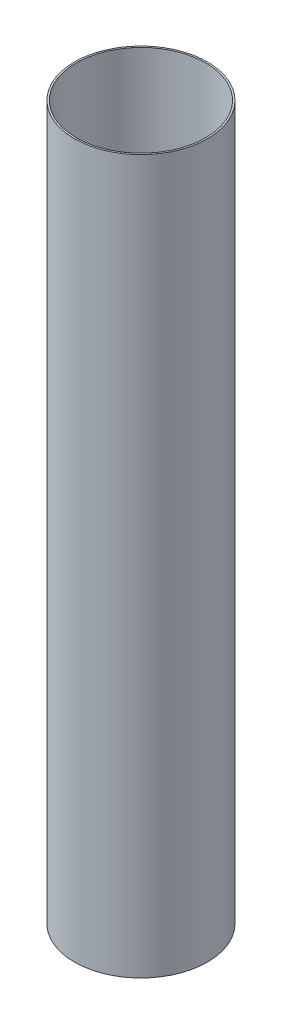
ISO-10303-21;
HEADER;
FILE_DESCRIPTION(('STEP AP214'),'2;1');
FILE_NAME('part.step','',(''),(''),'','','');
FILE_SCHEMA(('AUTOMOTIVE_DESIGN { 1 0 10303 214 1 1 1 1 }'));
ENDSEC;
DATA;
#1=APPLICATION_CONTEXT('core data for automotive mechanical design processes');
#2=APPLICATION_PROTOCOL_DEFINITION('international standard','automotive_design',2000,#1);
#3=PRODUCT_CONTEXT('',#1,'mechanical');
#4=PRODUCT('Part','Part','',(#3));
#5=PRODUCT_RELATED_PRODUCT_CATEGORY('part','',(#4));
#6=PRODUCT_DEFINITION_FORMATION('','',#4);
#7=PRODUCT_DEFINITION_CONTEXT('part definition',#1,'design');
#8=PRODUCT_DEFINITION('design','',#6,#7);
#9=PRODUCT_DEFINITION_SHAPE('','',#8);
#10=(LENGTH_UNIT() NAMED_UNIT(*) SI_UNIT(.MILLI.,.METRE.));
#11=(NAMED_UNIT(*) PLANE_ANGLE_UNIT() SI_UNIT($,.RADIAN.));
#12=(NAMED_UNIT(*) SI_UNIT($,.STERADIAN.) SOLID_ANGLE_UNIT());
#13=UNCERTAINTY_MEASURE_WITH_UNIT(LENGTH_MEASURE(1.E-05),#10,'distance_accuracy_value','');
#14=(GEOMETRIC_REPRESENTATION_CONTEXT(3) GLOBAL_UNCERTAINTY_ASSIGNED_CONTEXT((#13)) GLOBAL_UNIT_ASSIGNED_CONTEXT((#10,
#11,#12)) REPRESENTATION_CONTEXT('',''));
#15=CARTESIAN_POINT('',(0.,0.,0.));
#16=DIRECTION('',(0.,0.,1.));
#17=DIRECTION('',(1.,0.,0.));
#18=AXIS2_PLACEMENT_3D('',#15,#16,#17);
#19=CARTESIAN_POINT('',(0.,279.4,0.));
#20=DIRECTION('',(0.,1.,0.));
#21=DIRECTION('',(0.,0.,1.));
#22=AXIS2_PLACEMENT_3D('',#19,#20,#21);
#23=PLANE('',#22);
#24=CARTESIAN_POINT('',(0.,279.4,0.));
#25=DIRECTION('',(0.,1.,0.));
#26=DIRECTION('',(0.,0.,1.));
#27=AXIS2_PLACEMENT_3D('',#24,#25,#26);
#28=CIRCLE('',#27,26.0604);
#29=CARTESIAN_POINT('',(0.,279.4,26.0604));
#30=VERTEX_POINT('',#29);
#31=EDGE_CURVE('E10',#30,#30,#28,.T.);
#32=ORIENTED_EDGE('',*,*,#31,.T.);
#33=EDGE_LOOP('',(#32));
#34=FACE_BOUND('',#33,.T.);
#35=CARTESIAN_POINT('',(0.,279.4,0.));
#36=DIRECTION('',(0.,1.,0.));
#37=DIRECTION('',(0.,0.,1.));
#38=AXIS2_PLACEMENT_3D('',#35,#36,#37);
#39=CIRCLE('',#38,25.4);
#40=CARTESIAN_POINT('',(0.,279.4,25.4));
#41=VERTEX_POINT('',#40);
#42=EDGE_CURVE('E45',#41,#41,#39,.T.);
#43=ORIENTED_EDGE('',*,*,#42,.F.);
#44=EDGE_LOOP('',(#43));
#45=FACE_BOUND('',#44,.T.);
#46=ADVANCED_FACE('F34',(#34,#45),#23,.T.);
#47=CARTESIAN_POINT('',(0.,0.,0.));
#48=DIRECTION('',(0.,1.,0.));
#49=DIRECTION('',(0.,0.,1.));
#50=AXIS2_PLACEMENT_3D('',#47,#48,#49);
#51=PLANE('',#50);
#52=CARTESIAN_POINT('',(0.,0.,0.));
#53=DIRECTION('',(0.,1.,0.));
#54=DIRECTION('',(0.,0.,1.));
#55=AXIS2_PLACEMENT_3D('',#52,#53,#54);
#56=CIRCLE('',#55,26.0604);
#57=CARTESIAN_POINT('',(0.,0.,26.0604));
#58=VERTEX_POINT('',#57);
#59=EDGE_CURVE('E38',#58,#58,#56,.T.);
#60=ORIENTED_EDGE('',*,*,#59,.F.);
#61=EDGE_LOOP('',(#60));
#62=FACE_BOUND('',#61,.T.);
#63=CARTESIAN_POINT('',(0.,0.,0.));
#64=DIRECTION('',(0.,1.,0.));
#65=DIRECTION('',(0.,0.,1.));
#66=AXIS2_PLACEMENT_3D('',#63,#64,#65);
#67=CIRCLE('',#66,25.4);
#68=CARTESIAN_POINT('',(0.,0.,25.4));
#69=VERTEX_POINT('',#68);
#70=EDGE_CURVE('E47',#69,#69,#67,.T.);
#71=ORIENTED_EDGE('',*,*,#70,.T.);
#72=EDGE_LOOP('',(#71));
#73=FACE_BOUND('',#72,.T.);
#74=ADVANCED_FACE('F57',(#62,#73),#51,.F.);
#75=CARTESIAN_POINT('',(0.,279.4,0.));
#76=DIRECTION('',(0.,-1.,0.));
#77=DIRECTION('',(0.,0.,-1.));
#78=AXIS2_PLACEMENT_3D('',#75,#76,#77);
#79=CYLINDRICAL_SURFACE('',#78,26.0604);
#80=ORIENTED_EDGE('',*,*,#31,.F.);
#81=EDGE_LOOP('',(#80));
#82=FACE_BOUND('',#81,.T.);
#83=ORIENTED_EDGE('',*,*,#59,.T.);
#84=EDGE_LOOP('',(#83));
#85=FACE_BOUND('',#84,.T.);
#86=ADVANCED_FACE('F36',(#82,#85),#79,.T.);
#87=CARTESIAN_POINT('',(0.,279.4,0.));
#88=DIRECTION('',(0.,-1.,0.));
#89=DIRECTION('',(0.,0.,-1.));
#90=AXIS2_PLACEMENT_3D('',#87,#88,#89);
#91=CYLINDRICAL_SURFACE('',#90,25.4);
#92=ORIENTED_EDGE('',*,*,#42,.T.);
#93=EDGE_LOOP('',(#92));
#94=FACE_BOUND('',#93,.T.);
#95=ORIENTED_EDGE('',*,*,#70,.F.);
#96=EDGE_LOOP('',(#95));
#97=FACE_BOUND('',#96,.T.);
#98=ADVANCED_FACE('F53',(#94,#97),#91,.F.);
#99=CLOSED_SHELL('',(#46,#74,#86,#98));
#100=MANIFOLD_SOLID_BREP('B2',#99);
#101=ADVANCED_BREP_SHAPE_REPRESENTATION('',(#18,#100),#14);
#102=SHAPE_DEFINITION_REPRESENTATION(#9,#101);
ENDSEC;
END-ISO-10303-21;
